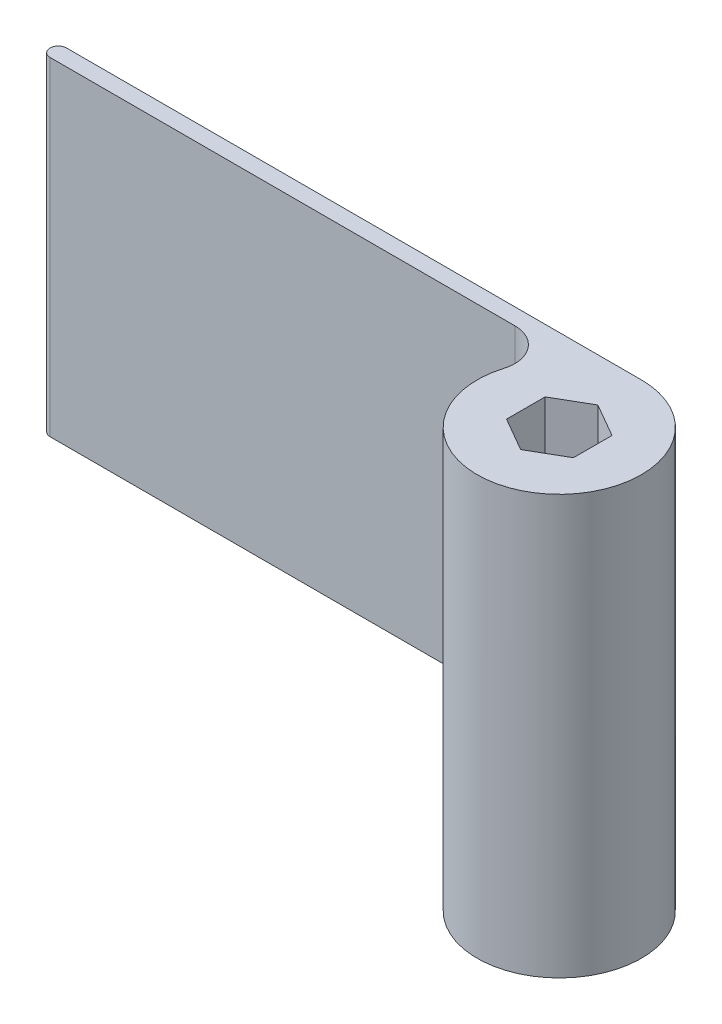
ISO-10303-21;
HEADER;
FILE_DESCRIPTION(('STEP AP214'),'2;1');
FILE_NAME('part.step','',(''),(''),'','','');
FILE_SCHEMA(('AUTOMOTIVE_DESIGN { 1 0 10303 214 1 1 1 1 }'));
ENDSEC;
DATA;
#1=APPLICATION_CONTEXT('core data for automotive mechanical design processes');
#2=APPLICATION_PROTOCOL_DEFINITION('international standard','automotive_design',2000,#1);
#3=PRODUCT_CONTEXT('',#1,'mechanical');
#4=PRODUCT('Part','Part','',(#3));
#5=PRODUCT_RELATED_PRODUCT_CATEGORY('part','',(#4));
#6=PRODUCT_DEFINITION_FORMATION('','',#4);
#7=PRODUCT_DEFINITION_CONTEXT('part definition',#1,'design');
#8=PRODUCT_DEFINITION('design','',#6,#7);
#9=PRODUCT_DEFINITION_SHAPE('','',#8);
#10=(LENGTH_UNIT() NAMED_UNIT(*) SI_UNIT(.MILLI.,.METRE.));
#11=(NAMED_UNIT(*) PLANE_ANGLE_UNIT() SI_UNIT($,.RADIAN.));
#12=(NAMED_UNIT(*) SI_UNIT($,.STERADIAN.) SOLID_ANGLE_UNIT());
#13=UNCERTAINTY_MEASURE_WITH_UNIT(LENGTH_MEASURE(1.E-05),#10,'distance_accuracy_value','');
#14=(GEOMETRIC_REPRESENTATION_CONTEXT(3) GLOBAL_UNCERTAINTY_ASSIGNED_CONTEXT((#13)) GLOBAL_UNIT_ASSIGNED_CONTEXT((#10,
#11,#12)) REPRESENTATION_CONTEXT('',''));
#15=CARTESIAN_POINT('',(0.,0.,0.));
#16=DIRECTION('',(0.,0.,1.));
#17=DIRECTION('',(1.,0.,0.));
#18=AXIS2_PLACEMENT_3D('',#15,#16,#17);
#19=CARTESIAN_POINT('',(0.,52.,0.));
#20=DIRECTION('',(0.,0.,1.));
#21=DIRECTION('',(-1.,0.,0.));
#22=AXIS2_PLACEMENT_3D('',#19,#20,#21);
#23=PLANE('',#22);
#24=DIRECTION('',(0.,-1.,0.));
#25=VECTOR('',#24,1.);
#26=CARTESIAN_POINT('',(9.59179606750063,52.,0.));
#27=LINE('',#26,#25);
#28=CARTESIAN_POINT('',(9.59179606750063,52.,0.));
#29=VERTEX_POINT('',#28);
#30=CARTESIAN_POINT('',(9.59179606750063,32.,0.));
#31=VERTEX_POINT('',#30);
#32=EDGE_CURVE('E154',#29,#31,#27,.T.);
#33=ORIENTED_EDGE('',*,*,#32,.F.);
#34=DIRECTION('',(1.,0.,0.));
#35=VECTOR('',#34,1.);
#36=CARTESIAN_POINT('',(0.,52.,0.));
#37=LINE('',#36,#35);
#38=CARTESIAN_POINT('',(-18.7,52.,0.));
#39=VERTEX_POINT('',#38);
#40=EDGE_CURVE('E145',#39,#29,#37,.T.);
#41=ORIENTED_EDGE('',*,*,#40,.F.);
#42=DIRECTION('',(0.,-1.,0.));
#43=VECTOR('',#42,1.);
#44=CARTESIAN_POINT('',(-18.7,52.,0.));
#45=LINE('',#44,#43);
#46=CARTESIAN_POINT('',(-18.7,32.,0.));
#47=VERTEX_POINT('',#46);
#48=EDGE_CURVE('E132',#39,#47,#45,.T.);
#49=ORIENTED_EDGE('',*,*,#48,.T.);
#50=DIRECTION('',(1.,0.,0.));
#51=VECTOR('',#50,1.);
#52=CARTESIAN_POINT('',(-18.7,32.,0.));
#53=LINE('',#52,#51);
#54=EDGE_CURVE('E137',#47,#31,#53,.T.);
#55=ORIENTED_EDGE('',*,*,#54,.T.);
#56=EDGE_LOOP('',(#33,#41,#49,#55));
#57=FACE_BOUND('',#56,.T.);
#58=ADVANCED_FACE('F43',(#57),#23,.T.);
#59=CARTESIAN_POINT('',(-18.7,52.,-0.499999999999996));
#60=DIRECTION('',(0.,-1.,0.));
#61=DIRECTION('',(0.,0.,1.));
#62=AXIS2_PLACEMENT_3D('',#59,#60,#61);
#63=CYLINDRICAL_SURFACE('',#62,0.5);
#64=ORIENTED_EDGE('',*,*,#48,.F.);
#65=CARTESIAN_POINT('',(-18.7,52.,-0.499999999999996));
#66=DIRECTION('',(0.,-1.,0.));
#67=DIRECTION('',(0.,0.,-1.));
#68=AXIS2_PLACEMENT_3D('',#65,#66,#67);
#69=CIRCLE('',#68,0.5);
#70=CARTESIAN_POINT('',(-18.7,52.,-0.999999999999995));
#71=VERTEX_POINT('',#70);
#72=EDGE_CURVE('E213',#71,#39,#69,.F.);
#73=ORIENTED_EDGE('',*,*,#72,.F.);
#74=DIRECTION('',(0.,-1.,0.));
#75=VECTOR('',#74,1.);
#76=CARTESIAN_POINT('',(-18.7,52.,-0.999999999999995));
#77=LINE('',#76,#75);
#78=CARTESIAN_POINT('',(-18.7,32.,-0.999999999999995));
#79=VERTEX_POINT('',#78);
#80=EDGE_CURVE('E135',#71,#79,#77,.T.);
#81=ORIENTED_EDGE('',*,*,#80,.T.);
#82=CARTESIAN_POINT('',(-18.7,32.,-0.499999999999996));
#83=DIRECTION('',(0.,1.,0.));
#84=DIRECTION('',(0.,0.,1.));
#85=AXIS2_PLACEMENT_3D('',#82,#83,#84);
#86=CIRCLE('',#85,0.5);
#87=EDGE_CURVE('E128',#79,#47,#86,.T.);
#88=ORIENTED_EDGE('',*,*,#87,.T.);
#89=EDGE_LOOP('',(#64,#73,#81,#88));
#90=FACE_BOUND('',#89,.T.);
#91=ADVANCED_FACE('F129',(#90),#63,.T.);
#92=CARTESIAN_POINT('',(0.,52.,-0.999999999999997));
#93=DIRECTION('',(0.,0.,-1.));
#94=DIRECTION('',(1.,0.,0.));
#95=AXIS2_PLACEMENT_3D('',#92,#93,#94);
#96=PLANE('',#95);
#97=ORIENTED_EDGE('',*,*,#80,.F.);
#98=DIRECTION('',(-1.,0.,0.));
#99=VECTOR('',#98,1.);
#100=CARTESIAN_POINT('',(0.,52.,-0.999999999999997));
#101=LINE('',#100,#99);
#102=CARTESIAN_POINT('',(16.3,52.,-0.999999999999999));
#103=VERTEX_POINT('',#102);
#104=EDGE_CURVE('E169',#103,#71,#101,.T.);
#105=ORIENTED_EDGE('',*,*,#104,.F.);
#106=DIRECTION('',(0.,-1.,0.));
#107=VECTOR('',#106,1.);
#108=CARTESIAN_POINT('',(16.3,52.,-0.999999999999999));
#109=LINE('',#108,#107);
#110=CARTESIAN_POINT('',(16.3,32.,-0.999999999999998));
#111=VERTEX_POINT('',#110);
#112=EDGE_CURVE('E150',#103,#111,#109,.T.);
#113=ORIENTED_EDGE('',*,*,#112,.T.);
#114=DIRECTION('',(-1.,0.,0.));
#115=VECTOR('',#114,1.);
#116=CARTESIAN_POINT('',(16.3,32.,-0.999999999999999));
#117=LINE('',#116,#115);
#118=EDGE_CURVE('E163',#111,#79,#117,.T.);
#119=ORIENTED_EDGE('',*,*,#118,.T.);
#120=EDGE_LOOP('',(#97,#105,#113,#119));
#121=FACE_BOUND('',#120,.T.);
#122=ADVANCED_FACE('F168',(#121),#96,.T.);
#123=CARTESIAN_POINT('',(9.59179606750063,52.,2.));
#124=DIRECTION('',(0.,-1.,0.));
#125=DIRECTION('',(0.,0.,1.));
#126=AXIS2_PLACEMENT_3D('',#123,#124,#125);
#127=CYLINDRICAL_SURFACE('',#126,2.);
#128=CARTESIAN_POINT('',(9.59179606750063,32.,2.));
#129=DIRECTION('',(0.,-1.,0.));
#130=DIRECTION('',(0.,0.,1.));
#131=AXIS2_PLACEMENT_3D('',#128,#129,#130);
#132=CIRCLE('',#131,2.);
#133=CARTESIAN_POINT('',(11.5084257625005,32.,2.57142857142857));
#134=VERTEX_POINT('',#133);
#135=EDGE_CURVE('E58',#31,#134,#132,.T.);
#136=ORIENTED_EDGE('',*,*,#135,.T.);
#137=DIRECTION('',(0.,-1.,0.));
#138=VECTOR('',#137,1.);
#139=CARTESIAN_POINT('',(11.5084257625005,52.,2.57142857142857));
#140=LINE('',#139,#138);
#141=CARTESIAN_POINT('',(11.5084257625005,52.,2.57142857142857));
#142=VERTEX_POINT('',#141);
#143=EDGE_CURVE('E51',#134,#142,#140,.F.);
#144=ORIENTED_EDGE('',*,*,#143,.T.);
#145=CARTESIAN_POINT('',(9.59179606750063,52.,2.));
#146=DIRECTION('',(0.,-1.,0.));
#147=DIRECTION('',(0.,0.,-1.));
#148=AXIS2_PLACEMENT_3D('',#145,#146,#147);
#149=CIRCLE('',#148,2.);
#150=EDGE_CURVE('E11',#142,#29,#149,.F.);
#151=ORIENTED_EDGE('',*,*,#150,.T.);
#152=ORIENTED_EDGE('',*,*,#32,.T.);
#153=EDGE_LOOP('',(#136,#144,#151,#152));
#154=FACE_BOUND('',#153,.T.);
#155=ADVANCED_FACE('F45',(#154),#127,.F.);
#156=CARTESIAN_POINT('',(0.,29.5,-1.99999999999999));
#157=DIRECTION('',(0.,1.,0.));
#158=DIRECTION('',(0.,0.,-1.));
#159=AXIS2_PLACEMENT_3D('',#156,#157,#158);
#160=PLANE('',#159);
#161=DIRECTION('',(0.866025403784439,0.,0.5));
#162=VECTOR('',#161,1.);
#163=CARTESIAN_POINT('',(2.4945036380934,29.5,-6.32060704084317));
#164=LINE('',#163,#162);
#165=CARTESIAN_POINT('',(16.3,29.5,1.65));
#166=VERTEX_POINT('',#165);
#167=CARTESIAN_POINT('',(18.3351596988934,29.5,2.825));
#168=VERTEX_POINT('',#167);
#169=EDGE_CURVE('E198',#166,#168,#164,.T.);
#170=ORIENTED_EDGE('',*,*,#169,.F.);
#171=DIRECTION('',(0.866025403784439,0.,-0.5));
#172=VECTOR('',#171,1.);
#173=CARTESIAN_POINT('',(5.6554963619066,29.5,7.79560704084318));
#174=LINE('',#173,#172);
#175=CARTESIAN_POINT('',(14.2648403011066,29.5,2.825));
#176=VERTEX_POINT('',#175);
#177=EDGE_CURVE('E195',#176,#166,#174,.T.);
#178=ORIENTED_EDGE('',*,*,#177,.F.);
#179=DIRECTION('',(0.,0.,-1.));
#180=VECTOR('',#179,1.);
#181=CARTESIAN_POINT('',(14.2648403011066,29.5,-2.));
#182=LINE('',#181,#180);
#183=CARTESIAN_POINT('',(14.2648403011066,29.5,5.175));
#184=VERTEX_POINT('',#183);
#185=EDGE_CURVE('E192',#184,#176,#182,.T.);
#186=ORIENTED_EDGE('',*,*,#185,.F.);
#187=DIRECTION('',(-0.866025403784438,0.,-0.500000000000001));
#188=VECTOR('',#187,1.);
#189=CARTESIAN_POINT('',(0.459343939199979,29.5,-2.79560704084319));
#190=LINE('',#189,#188);
#191=CARTESIAN_POINT('',(16.3,29.5,6.35));
#192=VERTEX_POINT('',#191);
#193=EDGE_CURVE('E189',#192,#184,#190,.T.);
#194=ORIENTED_EDGE('',*,*,#193,.F.);
#195=DIRECTION('',(-0.866025403784438,0.,0.500000000000001));
#196=VECTOR('',#195,1.);
#197=CARTESIAN_POINT('',(7.69065606080006,29.5,11.3206070408432));
#198=LINE('',#197,#196);
#199=CARTESIAN_POINT('',(18.3351596988934,29.5,5.175));
#200=VERTEX_POINT('',#199);
#201=EDGE_CURVE('E186',#200,#192,#198,.T.);
#202=ORIENTED_EDGE('',*,*,#201,.F.);
#203=DIRECTION('',(0.,0.,1.));
#204=VECTOR('',#203,1.);
#205=CARTESIAN_POINT('',(18.3351596988934,29.5,-1.99999999999997));
#206=LINE('',#205,#204);
#207=EDGE_CURVE('E183',#168,#200,#206,.T.);
#208=ORIENTED_EDGE('',*,*,#207,.F.);
#209=EDGE_LOOP('',(#170,#178,#186,#194,#202,#208));
#210=FACE_BOUND('',#209,.T.);
#211=CARTESIAN_POINT('',(16.3,29.5,4.));
#212=DIRECTION('',(0.,-1.,0.));
#213=DIRECTION('',(0.,0.,-1.));
#214=AXIS2_PLACEMENT_3D('',#211,#212,#213);
#215=CIRCLE('',#214,2.75);
#216=CARTESIAN_POINT('',(16.3,29.5,1.25));
#217=VERTEX_POINT('',#216);
#218=EDGE_CURVE('E155',#217,#217,#215,.T.);
#219=ORIENTED_EDGE('',*,*,#218,.T.);
#220=EDGE_LOOP('',(#219));
#221=FACE_BOUND('',#220,.T.);
#222=ADVANCED_FACE('F261',(#210,#221),#160,.F.);
#223=CARTESIAN_POINT('',(2.4945036380934,52.,-6.32060704084317));
#224=DIRECTION('',(-0.5,0.,0.866025403784439));
#225=DIRECTION('',(-0.866025403784439,0.,-0.5));
#226=AXIS2_PLACEMENT_3D('',#223,#224,#225);
#227=PLANE('',#226);
#228=ORIENTED_EDGE('',*,*,#169,.T.);
#229=DIRECTION('',(0.,-1.,0.));
#230=VECTOR('',#229,1.);
#231=CARTESIAN_POINT('',(18.3351596988934,52.,2.825));
#232=LINE('',#231,#230);
#233=CARTESIAN_POINT('',(18.3351596988934,52.,2.825));
#234=VERTEX_POINT('',#233);
#235=EDGE_CURVE('E146',#234,#168,#232,.T.);
#236=ORIENTED_EDGE('',*,*,#235,.F.);
#237=DIRECTION('',(0.866025403784439,0.,0.5));
#238=VECTOR('',#237,1.);
#239=CARTESIAN_POINT('',(2.4945036380934,52.,-6.32060704084317));
#240=LINE('',#239,#238);
#241=CARTESIAN_POINT('',(16.3,52.,1.65));
#242=VERTEX_POINT('',#241);
#243=EDGE_CURVE('E209',#242,#234,#240,.T.);
#244=ORIENTED_EDGE('',*,*,#243,.F.);
#245=DIRECTION('',(0.,-1.,0.));
#246=VECTOR('',#245,1.);
#247=CARTESIAN_POINT('',(16.3,52.,1.65));
#248=LINE('',#247,#246);
#249=EDGE_CURVE('E174',#242,#166,#248,.T.);
#250=ORIENTED_EDGE('',*,*,#249,.T.);
#251=EDGE_LOOP('',(#228,#236,#244,#250));
#252=FACE_BOUND('',#251,.T.);
#253=ADVANCED_FACE('F257',(#252),#227,.T.);
#254=CARTESIAN_POINT('',(5.6554963619066,52.,7.79560704084318));
#255=DIRECTION('',(0.5,0.,0.866025403784438));
#256=DIRECTION('',(-0.866025403784439,0.,0.5));
#257=AXIS2_PLACEMENT_3D('',#254,#255,#256);
#258=PLANE('',#257);
#259=ORIENTED_EDGE('',*,*,#177,.T.);
#260=ORIENTED_EDGE('',*,*,#249,.F.);
#261=DIRECTION('',(0.866025403784439,0.,-0.5));
#262=VECTOR('',#261,1.);
#263=CARTESIAN_POINT('',(5.6554963619066,52.,7.79560704084318));
#264=LINE('',#263,#262);
#265=CARTESIAN_POINT('',(14.2648403011066,52.,2.825));
#266=VERTEX_POINT('',#265);
#267=EDGE_CURVE('E207',#266,#242,#264,.T.);
#268=ORIENTED_EDGE('',*,*,#267,.F.);
#269=DIRECTION('',(0.,-1.,0.));
#270=VECTOR('',#269,1.);
#271=CARTESIAN_POINT('',(14.2648403011066,52.,2.825));
#272=LINE('',#271,#270);
#273=EDGE_CURVE('E176',#266,#176,#272,.T.);
#274=ORIENTED_EDGE('',*,*,#273,.T.);
#275=EDGE_LOOP('',(#259,#260,#268,#274));
#276=FACE_BOUND('',#275,.T.);
#277=ADVANCED_FACE('F260',(#276),#258,.T.);
#278=CARTESIAN_POINT('',(14.2648403011066,52.,-2.));
#279=DIRECTION('',(1.,0.,0.));
#280=DIRECTION('',(0.,0.,1.));
#281=AXIS2_PLACEMENT_3D('',#278,#279,#280);
#282=PLANE('',#281);
#283=ORIENTED_EDGE('',*,*,#185,.T.);
#284=ORIENTED_EDGE('',*,*,#273,.F.);
#285=DIRECTION('',(0.,0.,-1.));
#286=VECTOR('',#285,1.);
#287=CARTESIAN_POINT('',(14.2648403011066,52.,-2.));
#288=LINE('',#287,#286);
#289=CARTESIAN_POINT('',(14.2648403011066,52.,5.175));
#290=VERTEX_POINT('',#289);
#291=EDGE_CURVE('E205',#290,#266,#288,.T.);
#292=ORIENTED_EDGE('',*,*,#291,.F.);
#293=DIRECTION('',(0.,-1.,0.));
#294=VECTOR('',#293,1.);
#295=CARTESIAN_POINT('',(14.2648403011066,52.,5.175));
#296=LINE('',#295,#294);
#297=EDGE_CURVE('E178',#290,#184,#296,.T.);
#298=ORIENTED_EDGE('',*,*,#297,.T.);
#299=EDGE_LOOP('',(#283,#284,#292,#298));
#300=FACE_BOUND('',#299,.T.);
#301=ADVANCED_FACE('F265',(#300),#282,.T.);
#302=CARTESIAN_POINT('',(0.459343939199979,52.,-2.79560704084319));
#303=DIRECTION('',(0.500000000000001,0.,-0.866025403784438));
#304=DIRECTION('',(0.866025403784438,0.,0.500000000000001));
#305=AXIS2_PLACEMENT_3D('',#302,#303,#304);
#306=PLANE('',#305);
#307=ORIENTED_EDGE('',*,*,#193,.T.);
#308=ORIENTED_EDGE('',*,*,#297,.F.);
#309=DIRECTION('',(-0.866025403784438,0.,-0.500000000000001));
#310=VECTOR('',#309,1.);
#311=CARTESIAN_POINT('',(0.459343939199979,52.,-2.79560704084319));
#312=LINE('',#311,#310);
#313=CARTESIAN_POINT('',(16.3,52.,6.35));
#314=VERTEX_POINT('',#313);
#315=EDGE_CURVE('E203',#314,#290,#312,.T.);
#316=ORIENTED_EDGE('',*,*,#315,.F.);
#317=DIRECTION('',(0.,-1.,0.));
#318=VECTOR('',#317,1.);
#319=CARTESIAN_POINT('',(16.3,52.,6.35));
#320=LINE('',#319,#318);
#321=EDGE_CURVE('E180',#314,#192,#320,.T.);
#322=ORIENTED_EDGE('',*,*,#321,.T.);
#323=EDGE_LOOP('',(#307,#308,#316,#322));
#324=FACE_BOUND('',#323,.T.);
#325=ADVANCED_FACE('F244',(#324),#306,.T.);
#326=CARTESIAN_POINT('',(7.69065606080006,52.,11.3206070408432));
#327=DIRECTION('',(-0.500000000000002,0.,-0.866025403784438));
#328=DIRECTION('',(0.866025403784438,0.,-0.500000000000002));
#329=AXIS2_PLACEMENT_3D('',#326,#327,#328);
#330=PLANE('',#329);
#331=ORIENTED_EDGE('',*,*,#201,.T.);
#332=ORIENTED_EDGE('',*,*,#321,.F.);
#333=DIRECTION('',(-0.866025403784438,0.,0.500000000000001));
#334=VECTOR('',#333,1.);
#335=CARTESIAN_POINT('',(7.69065606080006,52.,11.3206070408432));
#336=LINE('',#335,#334);
#337=CARTESIAN_POINT('',(18.3351596988934,52.,5.175));
#338=VERTEX_POINT('',#337);
#339=EDGE_CURVE('E171',#338,#314,#336,.T.);
#340=ORIENTED_EDGE('',*,*,#339,.F.);
#341=DIRECTION('',(0.,-1.,0.));
#342=VECTOR('',#341,1.);
#343=CARTESIAN_POINT('',(18.3351596988934,52.,5.175));
#344=LINE('',#343,#342);
#345=EDGE_CURVE('E148',#338,#200,#344,.T.);
#346=ORIENTED_EDGE('',*,*,#345,.T.);
#347=EDGE_LOOP('',(#331,#332,#340,#346));
#348=FACE_BOUND('',#347,.T.);
#349=ADVANCED_FACE('F235',(#348),#330,.T.);
#350=CARTESIAN_POINT('',(16.3,52.,4.));
#351=DIRECTION('',(0.,-1.,0.));
#352=DIRECTION('',(0.,0.,1.));
#353=AXIS2_PLACEMENT_3D('',#350,#351,#352);
#354=CYLINDRICAL_SURFACE('',#353,5.);
#355=ORIENTED_EDGE('',*,*,#112,.F.);
#356=CARTESIAN_POINT('',(16.3,52.,4.));
#357=DIRECTION('',(0.,-1.,0.));
#358=DIRECTION('',(0.,0.,-1.));
#359=AXIS2_PLACEMENT_3D('',#356,#357,#358);
#360=CIRCLE('',#359,5.);
#361=EDGE_CURVE('E66',#103,#142,#360,.T.);
#362=ORIENTED_EDGE('',*,*,#361,.T.);
#363=ORIENTED_EDGE('',*,*,#143,.F.);
#364=CARTESIAN_POINT('',(16.3,32.,4.));
#365=DIRECTION('',(0.,-1.,0.));
#366=DIRECTION('',(0.,0.,1.));
#367=AXIS2_PLACEMENT_3D('',#364,#365,#366);
#368=CIRCLE('',#367,5.);
#369=EDGE_CURVE('E160',#134,#111,#368,.T.);
#370=ORIENTED_EDGE('',*,*,#369,.T.);
#371=EDGE_LOOP('',(#355,#362,#363,#370));
#372=FACE_BOUND('',#371,.T.);
#373=CARTESIAN_POINT('',(16.3,26.5,4.));
#374=DIRECTION('',(0.,-1.,0.));
#375=DIRECTION('',(0.,0.,-1.));
#376=AXIS2_PLACEMENT_3D('',#373,#374,#375);
#377=CIRCLE('',#376,5.);
#378=CARTESIAN_POINT('',(16.3,26.5,-0.999999999999999));
#379=VERTEX_POINT('',#378);
#380=EDGE_CURVE('E200',#379,#379,#377,.T.);
#381=ORIENTED_EDGE('',*,*,#380,.F.);
#382=EDGE_LOOP('',(#381));
#383=FACE_BOUND('',#382,.T.);
#384=ADVANCED_FACE('F158',(#372,#383),#354,.T.);
#385=CARTESIAN_POINT('',(18.3351596988934,52.,-1.99999999999997));
#386=DIRECTION('',(-1.,0.,0.));
#387=DIRECTION('',(0.,0.,-1.));
#388=AXIS2_PLACEMENT_3D('',#385,#386,#387);
#389=PLANE('',#388);
#390=ORIENTED_EDGE('',*,*,#207,.T.);
#391=ORIENTED_EDGE('',*,*,#345,.F.);
#392=DIRECTION('',(0.,0.,1.));
#393=VECTOR('',#392,1.);
#394=CARTESIAN_POINT('',(18.3351596988934,52.,-1.99999999999997));
#395=LINE('',#394,#393);
#396=EDGE_CURVE('E170',#234,#338,#395,.T.);
#397=ORIENTED_EDGE('',*,*,#396,.F.);
#398=ORIENTED_EDGE('',*,*,#235,.T.);
#399=EDGE_LOOP('',(#390,#391,#397,#398));
#400=FACE_BOUND('',#399,.T.);
#401=ADVANCED_FACE('F234',(#400),#389,.T.);
#402=CARTESIAN_POINT('',(0.,52.,-1.99999999999999));
#403=DIRECTION('',(0.,1.,0.));
#404=DIRECTION('',(0.,0.,-1.));
#405=AXIS2_PLACEMENT_3D('',#402,#403,#404);
#406=PLANE('',#405);
#407=ORIENTED_EDGE('',*,*,#361,.F.);
#408=ORIENTED_EDGE('',*,*,#104,.T.);
#409=ORIENTED_EDGE('',*,*,#72,.T.);
#410=ORIENTED_EDGE('',*,*,#40,.T.);
#411=ORIENTED_EDGE('',*,*,#150,.F.);
#412=EDGE_LOOP('',(#407,#408,#409,#410,#411));
#413=FACE_BOUND('',#412,.T.);
#414=ORIENTED_EDGE('',*,*,#243,.T.);
#415=ORIENTED_EDGE('',*,*,#396,.T.);
#416=ORIENTED_EDGE('',*,*,#339,.T.);
#417=ORIENTED_EDGE('',*,*,#315,.T.);
#418=ORIENTED_EDGE('',*,*,#291,.T.);
#419=ORIENTED_EDGE('',*,*,#267,.T.);
#420=EDGE_LOOP('',(#414,#415,#416,#417,#418,#419));
#421=FACE_BOUND('',#420,.T.);
#422=ADVANCED_FACE('F240',(#413,#421),#406,.T.);
#423=CARTESIAN_POINT('',(16.3,26.5,4.));
#424=DIRECTION('',(0.,1.,0.));
#425=DIRECTION('',(0.,0.,-1.));
#426=AXIS2_PLACEMENT_3D('',#423,#424,#425);
#427=CYLINDRICAL_SURFACE('',#426,2.75);
#428=CARTESIAN_POINT('',(16.3,26.5,4.));
#429=DIRECTION('',(0.,-1.,0.));
#430=DIRECTION('',(0.,0.,-1.));
#431=AXIS2_PLACEMENT_3D('',#428,#429,#430);
#432=CIRCLE('',#431,2.75);
#433=CARTESIAN_POINT('',(16.3,26.5,1.25));
#434=VERTEX_POINT('',#433);
#435=EDGE_CURVE('E166',#434,#434,#432,.T.);
#436=ORIENTED_EDGE('',*,*,#435,.T.);
#437=EDGE_LOOP('',(#436));
#438=FACE_BOUND('',#437,.T.);
#439=ORIENTED_EDGE('',*,*,#218,.F.);
#440=EDGE_LOOP('',(#439));
#441=FACE_BOUND('',#440,.T.);
#442=ADVANCED_FACE('F225',(#438,#441),#427,.F.);
#443=CARTESIAN_POINT('',(0.,26.5,-1.99999999999999));
#444=DIRECTION('',(0.,1.,0.));
#445=DIRECTION('',(0.,0.,-1.));
#446=AXIS2_PLACEMENT_3D('',#443,#444,#445);
#447=PLANE('',#446);
#448=ORIENTED_EDGE('',*,*,#435,.F.);
#449=EDGE_LOOP('',(#448));
#450=FACE_BOUND('',#449,.T.);
#451=ORIENTED_EDGE('',*,*,#380,.T.);
#452=EDGE_LOOP('',(#451));
#453=FACE_BOUND('',#452,.T.);
#454=ADVANCED_FACE('F228',(#450,#453),#447,.F.);
#455=CARTESIAN_POINT('',(-18.7,32.,-0.499999999999996));
#456=DIRECTION('',(0.,-1.,0.));
#457=DIRECTION('',(0.,0.,1.));
#458=AXIS2_PLACEMENT_3D('',#455,#456,#457);
#459=PLANE('',#458);
#460=ORIENTED_EDGE('',*,*,#87,.F.);
#461=ORIENTED_EDGE('',*,*,#118,.F.);
#462=ORIENTED_EDGE('',*,*,#369,.F.);
#463=ORIENTED_EDGE('',*,*,#135,.F.);
#464=ORIENTED_EDGE('',*,*,#54,.F.);
#465=EDGE_LOOP('',(#460,#461,#462,#463,#464));
#466=FACE_BOUND('',#465,.T.);
#467=ADVANCED_FACE('F139',(#466),#459,.T.);
#468=CLOSED_SHELL('',(#58,#91,#122,#155,#222,#253,#277,#301,#325,#349,#384,#401,#422,#442,#454,#467));
#469=MANIFOLD_SOLID_BREP('B2',#468);
#470=ADVANCED_BREP_SHAPE_REPRESENTATION('',(#18,#469),#14);
#471=SHAPE_DEFINITION_REPRESENTATION(#9,#470);
ENDSEC;
END-ISO-10303-21;
